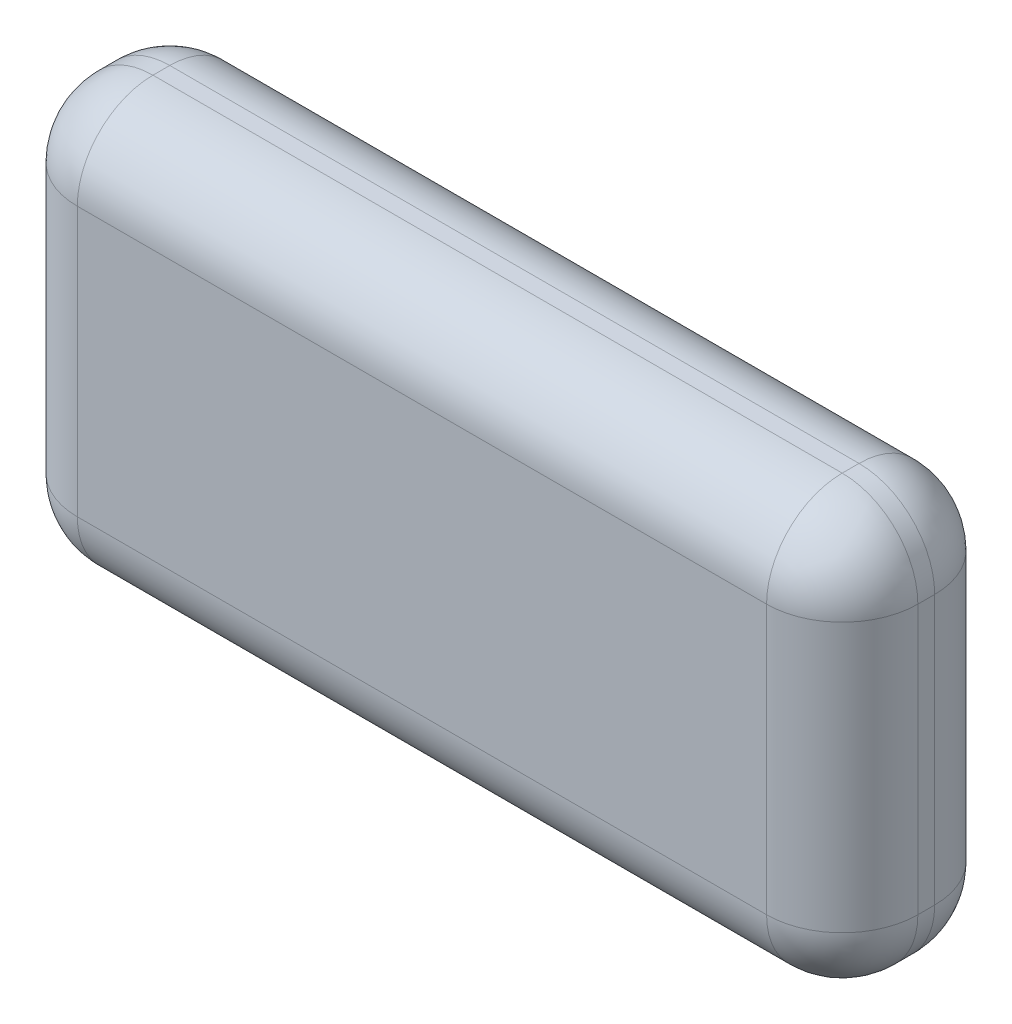
ISO-10303-21;
HEADER;
FILE_DESCRIPTION(('STEP AP214'),'2;1');
FILE_NAME('part.step','',(''),(''),'','','');
FILE_SCHEMA(('AUTOMOTIVE_DESIGN { 1 0 10303 214 1 1 1 1 }'));
ENDSEC;
DATA;
#1=APPLICATION_CONTEXT('core data for automotive mechanical design processes');
#2=APPLICATION_PROTOCOL_DEFINITION('international standard','automotive_design',2000,#1);
#3=PRODUCT_CONTEXT('',#1,'mechanical');
#4=PRODUCT('Part','Part','',(#3));
#5=PRODUCT_RELATED_PRODUCT_CATEGORY('part','',(#4));
#6=PRODUCT_DEFINITION_FORMATION('','',#4);
#7=PRODUCT_DEFINITION_CONTEXT('part definition',#1,'design');
#8=PRODUCT_DEFINITION('design','',#6,#7);
#9=PRODUCT_DEFINITION_SHAPE('','',#8);
#10=(LENGTH_UNIT() NAMED_UNIT(*) SI_UNIT(.MILLI.,.METRE.));
#11=(NAMED_UNIT(*) PLANE_ANGLE_UNIT() SI_UNIT($,.RADIAN.));
#12=(NAMED_UNIT(*) SI_UNIT($,.STERADIAN.) SOLID_ANGLE_UNIT());
#13=UNCERTAINTY_MEASURE_WITH_UNIT(LENGTH_MEASURE(1.E-05),#10,'distance_accuracy_value','');
#14=(GEOMETRIC_REPRESENTATION_CONTEXT(3) GLOBAL_UNCERTAINTY_ASSIGNED_CONTEXT((#13)) GLOBAL_UNIT_ASSIGNED_CONTEXT((#10,
#11,#12)) REPRESENTATION_CONTEXT('',''));
#15=CARTESIAN_POINT('',(0.,0.,0.));
#16=DIRECTION('',(0.,0.,1.));
#17=DIRECTION('',(1.,0.,0.));
#18=AXIS2_PLACEMENT_3D('',#15,#16,#17);
#19=CARTESIAN_POINT('',(-21.4107365792759,234.893882646692,100.));
#20=DIRECTION('',(1.,0.,0.));
#21=DIRECTION('',(0.,1.,0.));
#22=AXIS2_PLACEMENT_3D('',#19,#20,#21);
#23=PLANE('',#22);
#24=DIRECTION('',(0.,-1.,0.));
#25=VECTOR('',#24,1.);
#26=CARTESIAN_POINT('',(-21.4107365792759,234.893882646692,45.));
#27=LINE('',#26,#25);
#28=CARTESIAN_POINT('',(-21.4107365792759,189.893882646692,45.));
#29=VERTEX_POINT('',#28);
#30=CARTESIAN_POINT('',(-21.4107365792759,29.8938826466916,45.));
#31=VERTEX_POINT('',#30);
#32=EDGE_CURVE('E220',#29,#31,#27,.T.);
#33=ORIENTED_EDGE('',*,*,#32,.T.);
#34=DIRECTION('',(0.,0.,-1.));
#35=VECTOR('',#34,1.);
#36=CARTESIAN_POINT('',(-21.4107365792759,29.8938826466916,100.));
#37=LINE('',#36,#35);
#38=CARTESIAN_POINT('',(-21.4107365792759,29.8938826466916,55.));
#39=VERTEX_POINT('',#38);
#40=EDGE_CURVE('E224',#31,#39,#37,.F.);
#41=ORIENTED_EDGE('',*,*,#40,.T.);
#42=DIRECTION('',(0.,-1.,0.));
#43=VECTOR('',#42,1.);
#44=CARTESIAN_POINT('',(-21.4107365792759,234.893882646692,55.));
#45=LINE('',#44,#43);
#46=CARTESIAN_POINT('',(-21.4107365792759,189.893882646692,55.));
#47=VERTEX_POINT('',#46);
#48=EDGE_CURVE('E217',#39,#47,#45,.F.);
#49=ORIENTED_EDGE('',*,*,#48,.T.);
#50=DIRECTION('',(0.,0.,-1.));
#51=VECTOR('',#50,1.);
#52=CARTESIAN_POINT('',(-21.4107365792759,189.893882646692,100.));
#53=LINE('',#52,#51);
#54=EDGE_CURVE('E214',#47,#29,#53,.T.);
#55=ORIENTED_EDGE('',*,*,#54,.T.);
#56=EDGE_LOOP('',(#33,#41,#49,#55));
#57=FACE_BOUND('',#56,.T.);
#58=ADVANCED_FACE('F43',(#57),#23,.F.);
#59=CARTESIAN_POINT('',(-21.4107365792759,-15.1061173533084,100.));
#60=DIRECTION('',(0.,1.,0.));
#61=DIRECTION('',(0.,0.,1.));
#62=AXIS2_PLACEMENT_3D('',#59,#60,#61);
#63=PLANE('',#62);
#64=DIRECTION('',(1.,0.,0.));
#65=VECTOR('',#64,1.);
#66=CARTESIAN_POINT('',(-21.4107365792759,-15.1061173533084,55.));
#67=LINE('',#66,#65);
#68=CARTESIAN_POINT('',(433.589263420724,-15.1061173533084,55.));
#69=VERTEX_POINT('',#68);
#70=CARTESIAN_POINT('',(23.5892634207241,-15.1061173533084,55.));
#71=VERTEX_POINT('',#70);
#72=EDGE_CURVE('E164',#69,#71,#67,.F.);
#73=ORIENTED_EDGE('',*,*,#72,.T.);
#74=DIRECTION('',(0.,0.,-1.));
#75=VECTOR('',#74,1.);
#76=CARTESIAN_POINT('',(23.5892634207241,-15.1061173533084,100.));
#77=LINE('',#76,#75);
#78=CARTESIAN_POINT('',(23.5892634207241,-15.1061173533084,45.));
#79=VERTEX_POINT('',#78);
#80=EDGE_CURVE('E168',#71,#79,#77,.T.);
#81=ORIENTED_EDGE('',*,*,#80,.T.);
#82=DIRECTION('',(1.,0.,0.));
#83=VECTOR('',#82,1.);
#84=CARTESIAN_POINT('',(-21.4107365792759,-15.1061173533084,45.));
#85=LINE('',#84,#83);
#86=CARTESIAN_POINT('',(433.589263420724,-15.1061173533084,45.));
#87=VERTEX_POINT('',#86);
#88=EDGE_CURVE('E137',#79,#87,#85,.T.);
#89=ORIENTED_EDGE('',*,*,#88,.T.);
#90=DIRECTION('',(0.,0.,-1.));
#91=VECTOR('',#90,1.);
#92=CARTESIAN_POINT('',(433.589263420724,-15.1061173533084,100.));
#93=LINE('',#92,#91);
#94=EDGE_CURVE('E157',#87,#69,#93,.F.);
#95=ORIENTED_EDGE('',*,*,#94,.T.);
#96=EDGE_LOOP('',(#73,#81,#89,#95));
#97=FACE_BOUND('',#96,.T.);
#98=ADVANCED_FACE('F166',(#97),#63,.F.);
#99=CARTESIAN_POINT('',(478.589263420724,234.893882646692,100.));
#100=DIRECTION('',(-1.,0.,0.));
#101=DIRECTION('',(0.,0.,1.));
#102=AXIS2_PLACEMENT_3D('',#99,#100,#101);
#103=PLANE('',#102);
#104=DIRECTION('',(0.,1.,0.));
#105=VECTOR('',#104,1.);
#106=CARTESIAN_POINT('',(478.589263420724,234.893882646692,45.));
#107=LINE('',#106,#105);
#108=CARTESIAN_POINT('',(478.589263420724,29.8938826466916,45.));
#109=VERTEX_POINT('',#108);
#110=CARTESIAN_POINT('',(478.589263420724,189.893882646692,45.));
#111=VERTEX_POINT('',#110);
#112=EDGE_CURVE('E194',#109,#111,#107,.T.);
#113=ORIENTED_EDGE('',*,*,#112,.T.);
#114=DIRECTION('',(0.,0.,-1.));
#115=VECTOR('',#114,1.);
#116=CARTESIAN_POINT('',(478.589263420724,189.893882646692,100.));
#117=LINE('',#116,#115);
#118=CARTESIAN_POINT('',(478.589263420724,189.893882646692,55.));
#119=VERTEX_POINT('',#118);
#120=EDGE_CURVE('E198',#111,#119,#117,.F.);
#121=ORIENTED_EDGE('',*,*,#120,.T.);
#122=DIRECTION('',(0.,1.,0.));
#123=VECTOR('',#122,1.);
#124=CARTESIAN_POINT('',(478.589263420724,-15.1061173533084,55.));
#125=LINE('',#124,#123);
#126=CARTESIAN_POINT('',(478.589263420724,29.8938826466916,55.));
#127=VERTEX_POINT('',#126);
#128=EDGE_CURVE('E191',#119,#127,#125,.F.);
#129=ORIENTED_EDGE('',*,*,#128,.T.);
#130=DIRECTION('',(0.,0.,-1.));
#131=VECTOR('',#130,1.);
#132=CARTESIAN_POINT('',(478.589263420724,29.8938826466916,100.));
#133=LINE('',#132,#131);
#134=EDGE_CURVE('E188',#127,#109,#133,.T.);
#135=ORIENTED_EDGE('',*,*,#134,.T.);
#136=EDGE_LOOP('',(#113,#121,#129,#135));
#137=FACE_BOUND('',#136,.T.);
#138=ADVANCED_FACE('F385',(#137),#103,.F.);
#139=CARTESIAN_POINT('',(-21.4107365792759,234.893882646692,100.));
#140=DIRECTION('',(0.,-1.,0.));
#141=DIRECTION('',(0.,0.,-1.));
#142=AXIS2_PLACEMENT_3D('',#139,#140,#141);
#143=PLANE('',#142);
#144=DIRECTION('',(-1.,0.,0.));
#145=VECTOR('',#144,1.);
#146=CARTESIAN_POINT('',(-21.4107365792759,234.893882646692,45.));
#147=LINE('',#146,#145);
#148=CARTESIAN_POINT('',(433.589263420724,234.893882646692,45.));
#149=VERTEX_POINT('',#148);
#150=CARTESIAN_POINT('',(23.5892634207241,234.893882646692,45.));
#151=VERTEX_POINT('',#150);
#152=EDGE_CURVE('E207',#149,#151,#147,.T.);
#153=ORIENTED_EDGE('',*,*,#152,.T.);
#154=DIRECTION('',(0.,0.,-1.));
#155=VECTOR('',#154,1.);
#156=CARTESIAN_POINT('',(23.5892634207241,234.893882646692,100.));
#157=LINE('',#156,#155);
#158=CARTESIAN_POINT('',(23.5892634207241,234.893882646692,55.));
#159=VERTEX_POINT('',#158);
#160=EDGE_CURVE('E211',#151,#159,#157,.F.);
#161=ORIENTED_EDGE('',*,*,#160,.T.);
#162=DIRECTION('',(-1.,0.,0.));
#163=VECTOR('',#162,1.);
#164=CARTESIAN_POINT('',(478.589263420724,234.893882646692,55.));
#165=LINE('',#164,#163);
#166=CARTESIAN_POINT('',(433.589263420724,234.893882646692,55.));
#167=VERTEX_POINT('',#166);
#168=EDGE_CURVE('E204',#159,#167,#165,.F.);
#169=ORIENTED_EDGE('',*,*,#168,.T.);
#170=DIRECTION('',(0.,0.,-1.));
#171=VECTOR('',#170,1.);
#172=CARTESIAN_POINT('',(433.589263420724,234.893882646692,100.));
#173=LINE('',#172,#171);
#174=EDGE_CURVE('E201',#167,#149,#173,.T.);
#175=ORIENTED_EDGE('',*,*,#174,.T.);
#176=EDGE_LOOP('',(#153,#161,#169,#175));
#177=FACE_BOUND('',#176,.T.);
#178=ADVANCED_FACE('F352',(#177),#143,.F.);
#179=CARTESIAN_POINT('',(0.,0.,100.));
#180=DIRECTION('',(0.,0.,1.));
#181=DIRECTION('',(1.,0.,0.));
#182=AXIS2_PLACEMENT_3D('',#179,#180,#181);
#183=PLANE('',#182);
#184=DIRECTION('',(0.,1.,0.));
#185=VECTOR('',#184,1.);
#186=CARTESIAN_POINT('',(433.589263420724,234.893882646692,100.));
#187=LINE('',#186,#185);
#188=CARTESIAN_POINT('',(433.589263420724,29.8938826466916,100.));
#189=VERTEX_POINT('',#188);
#190=CARTESIAN_POINT('',(433.589263420724,189.893882646692,100.));
#191=VERTEX_POINT('',#190);
#192=EDGE_CURVE('E53',#189,#191,#187,.T.);
#193=ORIENTED_EDGE('',*,*,#192,.T.);
#194=DIRECTION('',(-1.,0.,0.));
#195=VECTOR('',#194,1.);
#196=CARTESIAN_POINT('',(-21.4107365792759,189.893882646692,100.));
#197=LINE('',#196,#195);
#198=CARTESIAN_POINT('',(23.5892634207241,189.893882646692,100.));
#199=VERTEX_POINT('',#198);
#200=EDGE_CURVE('E11',#191,#199,#197,.T.);
#201=ORIENTED_EDGE('',*,*,#200,.T.);
#202=DIRECTION('',(0.,-1.,0.));
#203=VECTOR('',#202,1.);
#204=CARTESIAN_POINT('',(23.5892634207241,-15.1061173533084,100.));
#205=LINE('',#204,#203);
#206=CARTESIAN_POINT('',(23.5892634207241,29.8938826466916,100.));
#207=VERTEX_POINT('',#206);
#208=EDGE_CURVE('E227',#199,#207,#205,.T.);
#209=ORIENTED_EDGE('',*,*,#208,.T.);
#210=DIRECTION('',(1.,0.,0.));
#211=VECTOR('',#210,1.);
#212=CARTESIAN_POINT('',(478.589263420724,29.8938826466916,100.));
#213=LINE('',#212,#211);
#214=EDGE_CURVE('E64',#207,#189,#213,.T.);
#215=ORIENTED_EDGE('',*,*,#214,.T.);
#216=EDGE_LOOP('',(#193,#201,#209,#215));
#217=FACE_BOUND('',#216,.T.);
#218=ADVANCED_FACE('F332',(#217),#183,.T.);
#219=CARTESIAN_POINT('',(0.,0.,0.));
#220=DIRECTION('',(0.,0.,1.));
#221=DIRECTION('',(1.,0.,0.));
#222=AXIS2_PLACEMENT_3D('',#219,#220,#221);
#223=PLANE('',#222);
#224=DIRECTION('',(0.,1.,0.));
#225=VECTOR('',#224,1.);
#226=CARTESIAN_POINT('',(433.589263420724,0.,0.));
#227=LINE('',#226,#225);
#228=CARTESIAN_POINT('',(433.589263420724,189.893882646692,0.));
#229=VERTEX_POINT('',#228);
#230=CARTESIAN_POINT('',(433.589263420724,29.8938826466916,0.));
#231=VERTEX_POINT('',#230);
#232=EDGE_CURVE('E183',#229,#231,#227,.F.);
#233=ORIENTED_EDGE('',*,*,#232,.T.);
#234=DIRECTION('',(1.,0.,0.));
#235=VECTOR('',#234,1.);
#236=CARTESIAN_POINT('',(0.,29.8938826466916,0.));
#237=LINE('',#236,#235);
#238=CARTESIAN_POINT('',(23.5892634207241,29.8938826466916,0.));
#239=VERTEX_POINT('',#238);
#240=EDGE_CURVE('E139',#231,#239,#237,.F.);
#241=ORIENTED_EDGE('',*,*,#240,.T.);
#242=DIRECTION('',(0.,-1.,0.));
#243=VECTOR('',#242,1.);
#244=CARTESIAN_POINT('',(23.5892634207241,0.,0.));
#245=LINE('',#244,#243);
#246=CARTESIAN_POINT('',(23.5892634207241,189.893882646692,0.));
#247=VERTEX_POINT('',#246);
#248=EDGE_CURVE('E174',#239,#247,#245,.F.);
#249=ORIENTED_EDGE('',*,*,#248,.T.);
#250=DIRECTION('',(-1.,0.,0.));
#251=VECTOR('',#250,1.);
#252=CARTESIAN_POINT('',(0.,189.893882646692,0.));
#253=LINE('',#252,#251);
#254=EDGE_CURVE('E180',#247,#229,#253,.F.);
#255=ORIENTED_EDGE('',*,*,#254,.T.);
#256=EDGE_LOOP('',(#233,#241,#249,#255));
#257=FACE_BOUND('',#256,.T.);
#258=ADVANCED_FACE('F413',(#257),#223,.F.);
#259=CARTESIAN_POINT('',(0.,189.893882646692,55.));
#260=DIRECTION('',(1.,0.,0.));
#261=DIRECTION('',(0.,0.,-1.));
#262=AXIS2_PLACEMENT_3D('',#259,#260,#261);
#263=CYLINDRICAL_SURFACE('',#262,45.);
#264=CARTESIAN_POINT('',(23.5892634207241,189.893882646692,55.));
#265=DIRECTION('',(-1.,0.,0.));
#266=DIRECTION('',(0.,0.,1.));
#267=AXIS2_PLACEMENT_3D('',#264,#265,#266);
#268=CIRCLE('',#267,45.);
#269=EDGE_CURVE('E47',#199,#159,#268,.T.);
#270=ORIENTED_EDGE('',*,*,#269,.F.);
#271=ORIENTED_EDGE('',*,*,#200,.F.);
#272=CARTESIAN_POINT('',(433.589263420724,189.893882646692,55.));
#273=DIRECTION('',(1.,0.,0.));
#274=DIRECTION('',(0.,0.,-1.));
#275=AXIS2_PLACEMENT_3D('',#272,#273,#274);
#276=CIRCLE('',#275,45.);
#277=EDGE_CURVE('E303',#167,#191,#276,.T.);
#278=ORIENTED_EDGE('',*,*,#277,.F.);
#279=ORIENTED_EDGE('',*,*,#168,.F.);
#280=EDGE_LOOP('',(#270,#271,#278,#279));
#281=FACE_BOUND('',#280,.T.);
#282=ADVANCED_FACE('F45',(#281),#263,.T.);
#283=CARTESIAN_POINT('',(23.5892634207241,189.893882646692,55.));
#284=DIRECTION('',(0.,1.,0.));
#285=DIRECTION('',(0.,0.,1.));
#286=AXIS2_PLACEMENT_3D('',#283,#284,#285);
#287=SPHERICAL_SURFACE('',#286,45.);
#288=CARTESIAN_POINT('',(23.5892634207241,189.893882646692,55.));
#289=DIRECTION('',(0.,1.,0.));
#290=DIRECTION('',(0.,0.,1.));
#291=AXIS2_PLACEMENT_3D('',#288,#289,#290);
#292=CIRCLE('',#291,45.);
#293=EDGE_CURVE('E296',#199,#47,#292,.F.);
#294=ORIENTED_EDGE('',*,*,#293,.F.);
#295=ORIENTED_EDGE('',*,*,#269,.T.);
#296=CARTESIAN_POINT('',(23.5892634207241,189.893882646692,55.));
#297=DIRECTION('',(0.,0.,1.));
#298=DIRECTION('',(1.,0.,0.));
#299=AXIS2_PLACEMENT_3D('',#296,#297,#298);
#300=CIRCLE('',#299,45.);
#301=EDGE_CURVE('E300',#47,#159,#300,.F.);
#302=ORIENTED_EDGE('',*,*,#301,.F.);
#303=EDGE_LOOP('',(#294,#295,#302));
#304=FACE_BOUND('',#303,.T.);
#305=ADVANCED_FACE('F316',(#304),#287,.T.);
#306=CARTESIAN_POINT('',(433.589263420724,189.893882646692,55.));
#307=DIRECTION('',(0.,0.,1.));
#308=DIRECTION('',(1.,0.,0.));
#309=AXIS2_PLACEMENT_3D('',#306,#307,#308);
#310=SPHERICAL_SURFACE('',#309,45.);
#311=CARTESIAN_POINT('',(433.589263420724,189.893882646692,55.));
#312=DIRECTION('',(0.,0.,1.));
#313=DIRECTION('',(1.,0.,0.));
#314=AXIS2_PLACEMENT_3D('',#311,#312,#313);
#315=CIRCLE('',#314,45.);
#316=EDGE_CURVE('E288',#167,#119,#315,.F.);
#317=ORIENTED_EDGE('',*,*,#316,.F.);
#318=ORIENTED_EDGE('',*,*,#277,.T.);
#319=CARTESIAN_POINT('',(433.589263420724,189.893882646692,55.));
#320=DIRECTION('',(0.,1.,0.));
#321=DIRECTION('',(0.,0.,1.));
#322=AXIS2_PLACEMENT_3D('',#319,#320,#321);
#323=CIRCLE('',#322,45.);
#324=EDGE_CURVE('E292',#119,#191,#323,.F.);
#325=ORIENTED_EDGE('',*,*,#324,.F.);
#326=EDGE_LOOP('',(#317,#318,#325));
#327=FACE_BOUND('',#326,.T.);
#328=ADVANCED_FACE('F344',(#327),#310,.T.);
#329=CARTESIAN_POINT('',(23.5892634207241,189.893882646692,100.));
#330=DIRECTION('',(0.,0.,-1.));
#331=DIRECTION('',(-1.,0.,0.));
#332=AXIS2_PLACEMENT_3D('',#329,#330,#331);
#333=CYLINDRICAL_SURFACE('',#332,45.);
#334=ORIENTED_EDGE('',*,*,#301,.T.);
#335=ORIENTED_EDGE('',*,*,#160,.F.);
#336=CARTESIAN_POINT('',(23.5892634207241,189.893882646692,45.));
#337=DIRECTION('',(0.,0.,-1.));
#338=DIRECTION('',(-1.,0.,0.));
#339=AXIS2_PLACEMENT_3D('',#336,#337,#338);
#340=CIRCLE('',#339,45.);
#341=EDGE_CURVE('E281',#29,#151,#340,.T.);
#342=ORIENTED_EDGE('',*,*,#341,.F.);
#343=ORIENTED_EDGE('',*,*,#54,.F.);
#344=EDGE_LOOP('',(#334,#335,#342,#343));
#345=FACE_BOUND('',#344,.T.);
#346=ADVANCED_FACE('F322',(#345),#333,.T.);
#347=CARTESIAN_POINT('',(23.5892634207241,0.,55.));
#348=DIRECTION('',(0.,1.,0.));
#349=DIRECTION('',(-1.,0.,0.));
#350=AXIS2_PLACEMENT_3D('',#347,#348,#349);
#351=CYLINDRICAL_SURFACE('',#350,45.);
#352=ORIENTED_EDGE('',*,*,#293,.T.);
#353=ORIENTED_EDGE('',*,*,#48,.F.);
#354=CARTESIAN_POINT('',(23.5892634207241,29.8938826466916,55.));
#355=DIRECTION('',(0.,-1.,0.));
#356=DIRECTION('',(1.,0.,0.));
#357=AXIS2_PLACEMENT_3D('',#354,#355,#356);
#358=CIRCLE('',#357,45.);
#359=EDGE_CURVE('E277',#207,#39,#358,.T.);
#360=ORIENTED_EDGE('',*,*,#359,.F.);
#361=ORIENTED_EDGE('',*,*,#208,.F.);
#362=EDGE_LOOP('',(#352,#353,#360,#361));
#363=FACE_BOUND('',#362,.T.);
#364=ADVANCED_FACE('F331',(#363),#351,.T.);
#365=CARTESIAN_POINT('',(0.,29.8938826466916,55.));
#366=DIRECTION('',(-1.,0.,0.));
#367=DIRECTION('',(0.,0.,1.));
#368=AXIS2_PLACEMENT_3D('',#365,#366,#367);
#369=CYLINDRICAL_SURFACE('',#368,45.);
#370=CARTESIAN_POINT('',(433.589263420724,29.8938826466916,55.));
#371=DIRECTION('',(1.,0.,0.));
#372=DIRECTION('',(0.,0.,-1.));
#373=AXIS2_PLACEMENT_3D('',#370,#371,#372);
#374=CIRCLE('',#373,45.);
#375=EDGE_CURVE('E269',#189,#69,#374,.T.);
#376=ORIENTED_EDGE('',*,*,#375,.F.);
#377=ORIENTED_EDGE('',*,*,#214,.F.);
#378=CARTESIAN_POINT('',(23.5892634207241,29.8938826466916,55.));
#379=DIRECTION('',(-1.,0.,0.));
#380=DIRECTION('',(0.,0.,1.));
#381=AXIS2_PLACEMENT_3D('',#378,#379,#380);
#382=CIRCLE('',#381,45.);
#383=EDGE_CURVE('E273',#71,#207,#382,.T.);
#384=ORIENTED_EDGE('',*,*,#383,.F.);
#385=ORIENTED_EDGE('',*,*,#72,.F.);
#386=EDGE_LOOP('',(#376,#377,#384,#385));
#387=FACE_BOUND('',#386,.T.);
#388=ADVANCED_FACE('F336',(#387),#369,.T.);
#389=CARTESIAN_POINT('',(433.589263420724,0.,55.));
#390=DIRECTION('',(0.,-1.,0.));
#391=DIRECTION('',(0.,0.,-1.));
#392=AXIS2_PLACEMENT_3D('',#389,#390,#391);
#393=CYLINDRICAL_SURFACE('',#392,45.);
#394=ORIENTED_EDGE('',*,*,#324,.T.);
#395=ORIENTED_EDGE('',*,*,#192,.F.);
#396=CARTESIAN_POINT('',(433.589263420724,29.8938826466916,55.));
#397=DIRECTION('',(0.,-1.,0.));
#398=DIRECTION('',(0.,0.,-1.));
#399=AXIS2_PLACEMENT_3D('',#396,#397,#398);
#400=CIRCLE('',#399,45.);
#401=EDGE_CURVE('E265',#127,#189,#400,.T.);
#402=ORIENTED_EDGE('',*,*,#401,.F.);
#403=ORIENTED_EDGE('',*,*,#128,.F.);
#404=EDGE_LOOP('',(#394,#395,#402,#403));
#405=FACE_BOUND('',#404,.T.);
#406=ADVANCED_FACE('F343',(#405),#393,.T.);
#407=CARTESIAN_POINT('',(433.589263420724,189.893882646692,100.));
#408=DIRECTION('',(0.,0.,-1.));
#409=DIRECTION('',(-1.,0.,0.));
#410=AXIS2_PLACEMENT_3D('',#407,#408,#409);
#411=CYLINDRICAL_SURFACE('',#410,45.);
#412=ORIENTED_EDGE('',*,*,#316,.T.);
#413=ORIENTED_EDGE('',*,*,#120,.F.);
#414=CARTESIAN_POINT('',(433.589263420724,189.893882646692,45.));
#415=DIRECTION('',(0.,0.,-1.));
#416=DIRECTION('',(-1.,0.,0.));
#417=AXIS2_PLACEMENT_3D('',#414,#415,#416);
#418=CIRCLE('',#417,45.);
#419=EDGE_CURVE('E261',#149,#111,#418,.T.);
#420=ORIENTED_EDGE('',*,*,#419,.F.);
#421=ORIENTED_EDGE('',*,*,#174,.F.);
#422=EDGE_LOOP('',(#412,#413,#420,#421));
#423=FACE_BOUND('',#422,.T.);
#424=ADVANCED_FACE('F349',(#423),#411,.T.);
#425=CARTESIAN_POINT('',(-21.4107365792759,189.893882646692,45.));
#426=DIRECTION('',(-1.,0.,0.));
#427=DIRECTION('',(0.,0.,1.));
#428=AXIS2_PLACEMENT_3D('',#425,#426,#427);
#429=CYLINDRICAL_SURFACE('',#428,45.);
#430=CARTESIAN_POINT('',(23.5892634207241,189.893882646692,45.));
#431=DIRECTION('',(-1.,0.,0.));
#432=DIRECTION('',(0.,0.,1.));
#433=AXIS2_PLACEMENT_3D('',#430,#431,#432);
#434=CIRCLE('',#433,45.);
#435=EDGE_CURVE('E284',#151,#247,#434,.T.);
#436=ORIENTED_EDGE('',*,*,#435,.F.);
#437=ORIENTED_EDGE('',*,*,#152,.F.);
#438=CARTESIAN_POINT('',(433.589263420724,189.893882646692,45.));
#439=DIRECTION('',(1.,0.,0.));
#440=DIRECTION('',(0.,0.,-1.));
#441=AXIS2_PLACEMENT_3D('',#438,#439,#440);
#442=CIRCLE('',#441,45.);
#443=EDGE_CURVE('E257',#229,#149,#442,.T.);
#444=ORIENTED_EDGE('',*,*,#443,.F.);
#445=ORIENTED_EDGE('',*,*,#254,.F.);
#446=EDGE_LOOP('',(#436,#437,#444,#445));
#447=FACE_BOUND('',#446,.T.);
#448=ADVANCED_FACE('F356',(#447),#429,.T.);
#449=CARTESIAN_POINT('',(23.5892634207241,189.893882646692,45.));
#450=DIRECTION('',(0.,1.,0.));
#451=DIRECTION('',(0.,0.,1.));
#452=AXIS2_PLACEMENT_3D('',#449,#450,#451);
#453=SPHERICAL_SURFACE('',#452,45.);
#454=ORIENTED_EDGE('',*,*,#341,.T.);
#455=ORIENTED_EDGE('',*,*,#435,.T.);
#456=CARTESIAN_POINT('',(23.5892634207241,189.893882646692,45.));
#457=DIRECTION('',(0.,1.,0.));
#458=DIRECTION('',(0.,0.,1.));
#459=AXIS2_PLACEMENT_3D('',#456,#457,#458);
#460=CIRCLE('',#459,45.);
#461=EDGE_CURVE('E253',#29,#247,#460,.F.);
#462=ORIENTED_EDGE('',*,*,#461,.F.);
#463=EDGE_LOOP('',(#454,#455,#462));
#464=FACE_BOUND('',#463,.T.);
#465=ADVANCED_FACE('F360',(#464),#453,.T.);
#466=CARTESIAN_POINT('',(23.5892634207241,29.8938826466916,55.));
#467=DIRECTION('',(0.,0.,1.));
#468=DIRECTION('',(1.,0.,0.));
#469=AXIS2_PLACEMENT_3D('',#466,#467,#468);
#470=SPHERICAL_SURFACE('',#469,45.);
#471=ORIENTED_EDGE('',*,*,#383,.T.);
#472=ORIENTED_EDGE('',*,*,#359,.T.);
#473=CARTESIAN_POINT('',(23.5892634207241,29.8938826466916,55.));
#474=DIRECTION('',(0.,0.,1.));
#475=DIRECTION('',(1.,0.,0.));
#476=AXIS2_PLACEMENT_3D('',#473,#474,#475);
#477=CIRCLE('',#476,45.);
#478=EDGE_CURVE('E249',#71,#39,#477,.F.);
#479=ORIENTED_EDGE('',*,*,#478,.F.);
#480=EDGE_LOOP('',(#471,#472,#479));
#481=FACE_BOUND('',#480,.T.);
#482=ADVANCED_FACE('F370',(#481),#470,.T.);
#483=CARTESIAN_POINT('',(433.589263420724,29.8938826466916,55.));
#484=DIRECTION('',(0.,0.,1.));
#485=DIRECTION('',(1.,0.,0.));
#486=AXIS2_PLACEMENT_3D('',#483,#484,#485);
#487=SPHERICAL_SURFACE('',#486,45.);
#488=ORIENTED_EDGE('',*,*,#401,.T.);
#489=ORIENTED_EDGE('',*,*,#375,.T.);
#490=CARTESIAN_POINT('',(433.589263420724,29.8938826466916,55.));
#491=DIRECTION('',(0.,0.,1.));
#492=DIRECTION('',(1.,0.,0.));
#493=AXIS2_PLACEMENT_3D('',#490,#491,#492);
#494=CIRCLE('',#493,45.);
#495=EDGE_CURVE('E160',#127,#69,#494,.F.);
#496=ORIENTED_EDGE('',*,*,#495,.F.);
#497=EDGE_LOOP('',(#488,#489,#496));
#498=FACE_BOUND('',#497,.T.);
#499=ADVANCED_FACE('F340',(#498),#487,.T.);
#500=CARTESIAN_POINT('',(433.589263420724,189.893882646692,45.));
#501=DIRECTION('',(0.,1.,0.));
#502=DIRECTION('',(0.,0.,1.));
#503=AXIS2_PLACEMENT_3D('',#500,#501,#502);
#504=SPHERICAL_SURFACE('',#503,45.);
#505=ORIENTED_EDGE('',*,*,#443,.T.);
#506=ORIENTED_EDGE('',*,*,#419,.T.);
#507=CARTESIAN_POINT('',(433.589263420724,189.893882646692,45.));
#508=DIRECTION('',(0.,1.,0.));
#509=DIRECTION('',(0.,0.,1.));
#510=AXIS2_PLACEMENT_3D('',#507,#508,#509);
#511=CIRCLE('',#510,45.);
#512=EDGE_CURVE('E244',#229,#111,#511,.F.);
#513=ORIENTED_EDGE('',*,*,#512,.F.);
#514=EDGE_LOOP('',(#505,#506,#513));
#515=FACE_BOUND('',#514,.T.);
#516=ADVANCED_FACE('F377',(#515),#504,.T.);
#517=CARTESIAN_POINT('',(23.5892634207241,234.893882646692,45.));
#518=DIRECTION('',(0.,-1.,0.));
#519=DIRECTION('',(1.,0.,0.));
#520=AXIS2_PLACEMENT_3D('',#517,#518,#519);
#521=CYLINDRICAL_SURFACE('',#520,45.);
#522=ORIENTED_EDGE('',*,*,#461,.T.);
#523=ORIENTED_EDGE('',*,*,#248,.F.);
#524=CARTESIAN_POINT('',(23.5892634207241,29.8938826466916,45.));
#525=DIRECTION('',(0.,-1.,0.));
#526=DIRECTION('',(1.,0.,0.));
#527=AXIS2_PLACEMENT_3D('',#524,#525,#526);
#528=CIRCLE('',#527,45.);
#529=EDGE_CURVE('E240',#31,#239,#528,.T.);
#530=ORIENTED_EDGE('',*,*,#529,.F.);
#531=ORIENTED_EDGE('',*,*,#32,.F.);
#532=EDGE_LOOP('',(#522,#523,#530,#531));
#533=FACE_BOUND('',#532,.T.);
#534=ADVANCED_FACE('F363',(#533),#521,.T.);
#535=CARTESIAN_POINT('',(23.5892634207241,29.8938826466916,100.));
#536=DIRECTION('',(0.,0.,-1.));
#537=DIRECTION('',(-1.,0.,0.));
#538=AXIS2_PLACEMENT_3D('',#535,#536,#537);
#539=CYLINDRICAL_SURFACE('',#538,45.);
#540=ORIENTED_EDGE('',*,*,#478,.T.);
#541=ORIENTED_EDGE('',*,*,#40,.F.);
#542=CARTESIAN_POINT('',(23.5892634207241,29.8938826466916,45.));
#543=DIRECTION('',(0.,0.,-1.));
#544=DIRECTION('',(-1.,0.,0.));
#545=AXIS2_PLACEMENT_3D('',#542,#543,#544);
#546=CIRCLE('',#545,45.);
#547=EDGE_CURVE('E154',#79,#31,#546,.T.);
#548=ORIENTED_EDGE('',*,*,#547,.F.);
#549=ORIENTED_EDGE('',*,*,#80,.F.);
#550=EDGE_LOOP('',(#540,#541,#548,#549));
#551=FACE_BOUND('',#550,.T.);
#552=ADVANCED_FACE('F368',(#551),#539,.T.);
#553=CARTESIAN_POINT('',(433.589263420724,29.8938826466916,100.));
#554=DIRECTION('',(0.,0.,-1.));
#555=DIRECTION('',(-1.,0.,0.));
#556=AXIS2_PLACEMENT_3D('',#553,#554,#555);
#557=CYLINDRICAL_SURFACE('',#556,45.);
#558=ORIENTED_EDGE('',*,*,#495,.T.);
#559=ORIENTED_EDGE('',*,*,#94,.F.);
#560=CARTESIAN_POINT('',(433.589263420724,29.8938826466916,45.));
#561=DIRECTION('',(0.,0.,-1.));
#562=DIRECTION('',(-1.,0.,0.));
#563=AXIS2_PLACEMENT_3D('',#560,#561,#562);
#564=CIRCLE('',#563,45.);
#565=EDGE_CURVE('E146',#109,#87,#564,.T.);
#566=ORIENTED_EDGE('',*,*,#565,.F.);
#567=ORIENTED_EDGE('',*,*,#134,.F.);
#568=EDGE_LOOP('',(#558,#559,#566,#567));
#569=FACE_BOUND('',#568,.T.);
#570=ADVANCED_FACE('F158',(#569),#557,.T.);
#571=CARTESIAN_POINT('',(433.589263420724,234.893882646692,45.));
#572=DIRECTION('',(0.,1.,0.));
#573=DIRECTION('',(0.,0.,1.));
#574=AXIS2_PLACEMENT_3D('',#571,#572,#573);
#575=CYLINDRICAL_SURFACE('',#574,45.);
#576=ORIENTED_EDGE('',*,*,#512,.T.);
#577=ORIENTED_EDGE('',*,*,#112,.F.);
#578=CARTESIAN_POINT('',(433.589263420724,29.8938826466916,45.));
#579=DIRECTION('',(0.,-1.,0.));
#580=DIRECTION('',(1.,0.,0.));
#581=AXIS2_PLACEMENT_3D('',#578,#579,#580);
#582=CIRCLE('',#581,45.);
#583=EDGE_CURVE('E150',#231,#109,#582,.T.);
#584=ORIENTED_EDGE('',*,*,#583,.F.);
#585=ORIENTED_EDGE('',*,*,#232,.F.);
#586=EDGE_LOOP('',(#576,#577,#584,#585));
#587=FACE_BOUND('',#586,.T.);
#588=ADVANCED_FACE('F396',(#587),#575,.T.);
#589=CARTESIAN_POINT('',(23.5892634207241,29.8938826466916,45.));
#590=DIRECTION('',(-1.,0.,0.));
#591=DIRECTION('',(0.,-1.,0.));
#592=AXIS2_PLACEMENT_3D('',#589,#590,#591);
#593=SPHERICAL_SURFACE('',#592,45.);
#594=ORIENTED_EDGE('',*,*,#547,.T.);
#595=ORIENTED_EDGE('',*,*,#529,.T.);
#596=CARTESIAN_POINT('',(23.5892634207241,29.8938826466916,45.));
#597=DIRECTION('',(-1.,0.,0.));
#598=DIRECTION('',(0.,-1.,0.));
#599=AXIS2_PLACEMENT_3D('',#596,#597,#598);
#600=CIRCLE('',#599,45.);
#601=EDGE_CURVE('E143',#79,#239,#600,.F.);
#602=ORIENTED_EDGE('',*,*,#601,.F.);
#603=EDGE_LOOP('',(#594,#595,#602));
#604=FACE_BOUND('',#603,.T.);
#605=ADVANCED_FACE('F393',(#604),#593,.T.);
#606=CARTESIAN_POINT('',(433.589263420724,29.8938826466916,45.));
#607=DIRECTION('',(1.,0.,0.));
#608=DIRECTION('',(0.,1.,0.));
#609=AXIS2_PLACEMENT_3D('',#606,#607,#608);
#610=SPHERICAL_SURFACE('',#609,45.);
#611=ORIENTED_EDGE('',*,*,#583,.T.);
#612=ORIENTED_EDGE('',*,*,#565,.T.);
#613=CARTESIAN_POINT('',(433.589263420724,29.8938826466916,45.));
#614=DIRECTION('',(1.,0.,0.));
#615=DIRECTION('',(0.,0.,-1.));
#616=AXIS2_PLACEMENT_3D('',#613,#614,#615);
#617=CIRCLE('',#616,45.);
#618=EDGE_CURVE('E133',#231,#87,#617,.F.);
#619=ORIENTED_EDGE('',*,*,#618,.F.);
#620=EDGE_LOOP('',(#611,#612,#619));
#621=FACE_BOUND('',#620,.T.);
#622=ADVANCED_FACE('F148',(#621),#610,.T.);
#623=CARTESIAN_POINT('',(-21.4107365792759,29.8938826466916,45.));
#624=DIRECTION('',(1.,0.,0.));
#625=DIRECTION('',(0.,0.,-1.));
#626=AXIS2_PLACEMENT_3D('',#623,#624,#625);
#627=CYLINDRICAL_SURFACE('',#626,45.);
#628=ORIENTED_EDGE('',*,*,#601,.T.);
#629=ORIENTED_EDGE('',*,*,#240,.F.);
#630=ORIENTED_EDGE('',*,*,#618,.T.);
#631=ORIENTED_EDGE('',*,*,#88,.F.);
#632=EDGE_LOOP('',(#628,#629,#630,#631));
#633=FACE_BOUND('',#632,.T.);
#634=ADVANCED_FACE('F135',(#633),#627,.T.);
#635=CLOSED_SHELL('',(#58,#98,#138,#178,#218,#258,#282,#305,#328,#346,#364,#388,#406,#424,#448,
#465,#482,#499,#516,#534,#552,#570,#588,#605,#622,#634));
#636=MANIFOLD_SOLID_BREP('B2',#635);
#637=ADVANCED_BREP_SHAPE_REPRESENTATION('',(#18,#636),#14);
#638=SHAPE_DEFINITION_REPRESENTATION(#9,#637);
ENDSEC;
END-ISO-10303-21;
